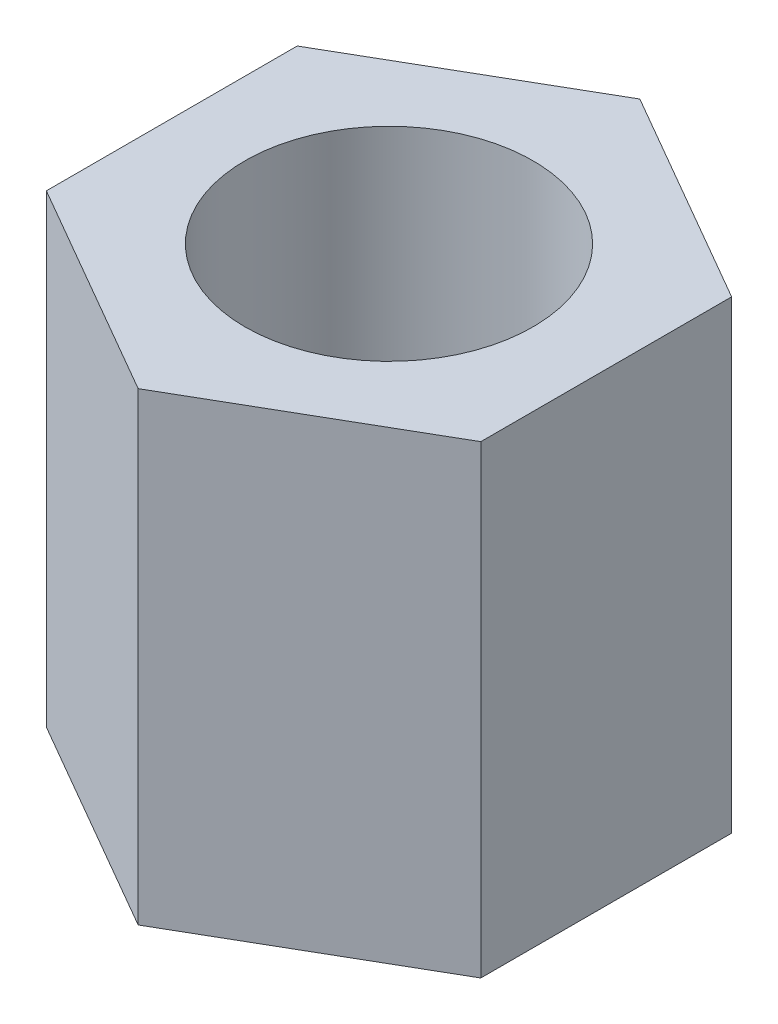
ISO-10303-21;
HEADER;
FILE_DESCRIPTION(('STEP AP214'),'2;1');
FILE_NAME('part.step','',(''),(''),'','','');
FILE_SCHEMA(('AUTOMOTIVE_DESIGN { 1 0 10303 214 1 1 1 1 }'));
ENDSEC;
DATA;
#1=APPLICATION_CONTEXT('core data for automotive mechanical design processes');
#2=APPLICATION_PROTOCOL_DEFINITION('international standard','automotive_design',2000,#1);
#3=PRODUCT_CONTEXT('',#1,'mechanical');
#4=PRODUCT('Part','Part','',(#3));
#5=PRODUCT_RELATED_PRODUCT_CATEGORY('part','',(#4));
#6=PRODUCT_DEFINITION_FORMATION('','',#4);
#7=PRODUCT_DEFINITION_CONTEXT('part definition',#1,'design');
#8=PRODUCT_DEFINITION('design','',#6,#7);
#9=PRODUCT_DEFINITION_SHAPE('','',#8);
#10=(LENGTH_UNIT() NAMED_UNIT(*) SI_UNIT(.MILLI.,.METRE.));
#11=(NAMED_UNIT(*) PLANE_ANGLE_UNIT() SI_UNIT($,.RADIAN.));
#12=(NAMED_UNIT(*) SI_UNIT($,.STERADIAN.) SOLID_ANGLE_UNIT());
#13=UNCERTAINTY_MEASURE_WITH_UNIT(LENGTH_MEASURE(1.E-05),#10,'distance_accuracy_value','');
#14=(GEOMETRIC_REPRESENTATION_CONTEXT(3) GLOBAL_UNCERTAINTY_ASSIGNED_CONTEXT((#13)) GLOBAL_UNIT_ASSIGNED_CONTEXT((#10,
#11,#12)) REPRESENTATION_CONTEXT('',''));
#15=CARTESIAN_POINT('',(0.,0.,0.));
#16=DIRECTION('',(0.,0.,1.));
#17=DIRECTION('',(1.,0.,0.));
#18=AXIS2_PLACEMENT_3D('',#15,#16,#17);
#19=CARTESIAN_POINT('',(0.,5.,0.));
#20=DIRECTION('',(0.,1.,0.));
#21=DIRECTION('',(0.,0.,1.));
#22=AXIS2_PLACEMENT_3D('',#19,#20,#21);
#23=PLANE('',#22);
#24=DIRECTION('',(-0.866025403784439,0.,-0.5));
#25=VECTOR('',#24,1.);
#26=CARTESIAN_POINT('',(2.33826859021798,5.,-1.35));
#27=LINE('',#26,#25);
#28=CARTESIAN_POINT('',(2.33826859021798,5.,-1.35));
#29=VERTEX_POINT('',#28);
#30=CARTESIAN_POINT('',(0.,5.,-2.7));
#31=VERTEX_POINT('',#30);
#32=EDGE_CURVE('E130',#29,#31,#27,.T.);
#33=ORIENTED_EDGE('',*,*,#32,.T.);
#34=DIRECTION('',(-0.866025403784439,0.,0.5));
#35=VECTOR('',#34,1.);
#36=CARTESIAN_POINT('',(0.,5.,-2.7));
#37=LINE('',#36,#35);
#38=CARTESIAN_POINT('',(-2.33826859021798,5.,-1.35));
#39=VERTEX_POINT('',#38);
#40=EDGE_CURVE('E88',#31,#39,#37,.T.);
#41=ORIENTED_EDGE('',*,*,#40,.T.);
#42=DIRECTION('',(0.,0.,1.));
#43=VECTOR('',#42,1.);
#44=CARTESIAN_POINT('',(-2.33826859021798,5.,-1.35));
#45=LINE('',#44,#43);
#46=CARTESIAN_POINT('',(-2.33826859021798,5.,1.35));
#47=VERTEX_POINT('',#46);
#48=EDGE_CURVE('E101',#39,#47,#45,.T.);
#49=ORIENTED_EDGE('',*,*,#48,.T.);
#50=DIRECTION('',(0.866025403784439,0.,0.5));
#51=VECTOR('',#50,1.);
#52=CARTESIAN_POINT('',(-2.33826859021798,5.,1.35));
#53=LINE('',#52,#51);
#54=CARTESIAN_POINT('',(0.,5.,2.7));
#55=VERTEX_POINT('',#54);
#56=EDGE_CURVE('E95',#47,#55,#53,.T.);
#57=ORIENTED_EDGE('',*,*,#56,.T.);
#58=DIRECTION('',(0.866025403784439,0.,-0.5));
#59=VECTOR('',#58,1.);
#60=CARTESIAN_POINT('',(0.,5.,2.7));
#61=LINE('',#60,#59);
#62=CARTESIAN_POINT('',(2.33826859021798,5.,1.35));
#63=VERTEX_POINT('',#62);
#64=EDGE_CURVE('E99',#55,#63,#61,.T.);
#65=ORIENTED_EDGE('',*,*,#64,.T.);
#66=DIRECTION('',(0.,0.,-1.));
#67=VECTOR('',#66,1.);
#68=CARTESIAN_POINT('',(2.33826859021798,5.,1.35));
#69=LINE('',#68,#67);
#70=EDGE_CURVE('E51',#63,#29,#69,.T.);
#71=ORIENTED_EDGE('',*,*,#70,.T.);
#72=EDGE_LOOP('',(#33,#41,#49,#57,#65,#71));
#73=FACE_BOUND('',#72,.T.);
#74=CARTESIAN_POINT('',(0.,5.,0.));
#75=DIRECTION('',(0.,1.,0.));
#76=DIRECTION('',(0.,0.,1.));
#77=AXIS2_PLACEMENT_3D('',#74,#75,#76);
#78=CIRCLE('',#77,1.55);
#79=CARTESIAN_POINT('',(0.,5.,1.55));
#80=VERTEX_POINT('',#79);
#81=EDGE_CURVE('E123',#80,#80,#78,.T.);
#82=ORIENTED_EDGE('',*,*,#81,.F.);
#83=EDGE_LOOP('',(#82));
#84=FACE_BOUND('',#83,.T.);
#85=ADVANCED_FACE('F34',(#73,#84),#23,.T.);
#86=CARTESIAN_POINT('',(0.,0.,0.));
#87=DIRECTION('',(0.,1.,0.));
#88=DIRECTION('',(0.,0.,1.));
#89=AXIS2_PLACEMENT_3D('',#86,#87,#88);
#90=PLANE('',#89);
#91=DIRECTION('',(-0.866025403784439,0.,-0.5));
#92=VECTOR('',#91,1.);
#93=CARTESIAN_POINT('',(2.33826859021798,0.,-1.35));
#94=LINE('',#93,#92);
#95=CARTESIAN_POINT('',(2.33826859021798,0.,-1.35));
#96=VERTEX_POINT('',#95);
#97=CARTESIAN_POINT('',(0.,0.,-2.7));
#98=VERTEX_POINT('',#97);
#99=EDGE_CURVE('E119',#96,#98,#94,.T.);
#100=ORIENTED_EDGE('',*,*,#99,.F.);
#101=DIRECTION('',(0.,0.,-1.));
#102=VECTOR('',#101,1.);
#103=CARTESIAN_POINT('',(2.33826859021798,0.,1.35));
#104=LINE('',#103,#102);
#105=CARTESIAN_POINT('',(2.33826859021798,0.,1.35));
#106=VERTEX_POINT('',#105);
#107=EDGE_CURVE('E80',#106,#96,#104,.T.);
#108=ORIENTED_EDGE('',*,*,#107,.F.);
#109=DIRECTION('',(0.866025403784439,0.,-0.5));
#110=VECTOR('',#109,1.);
#111=CARTESIAN_POINT('',(0.,0.,2.7));
#112=LINE('',#111,#110);
#113=CARTESIAN_POINT('',(0.,0.,2.7));
#114=VERTEX_POINT('',#113);
#115=EDGE_CURVE('E74',#114,#106,#112,.T.);
#116=ORIENTED_EDGE('',*,*,#115,.F.);
#117=DIRECTION('',(0.866025403784439,0.,0.5));
#118=VECTOR('',#117,1.);
#119=CARTESIAN_POINT('',(-2.33826859021798,0.,1.35));
#120=LINE('',#119,#118);
#121=CARTESIAN_POINT('',(-2.33826859021798,0.,1.35));
#122=VERTEX_POINT('',#121);
#123=EDGE_CURVE('E109',#122,#114,#120,.T.);
#124=ORIENTED_EDGE('',*,*,#123,.F.);
#125=DIRECTION('',(0.,0.,1.));
#126=VECTOR('',#125,1.);
#127=CARTESIAN_POINT('',(-2.33826859021798,0.,-1.35));
#128=LINE('',#127,#126);
#129=CARTESIAN_POINT('',(-2.33826859021798,0.,-1.35));
#130=VERTEX_POINT('',#129);
#131=EDGE_CURVE('E125',#130,#122,#128,.T.);
#132=ORIENTED_EDGE('',*,*,#131,.F.);
#133=DIRECTION('',(-0.866025403784439,0.,0.5));
#134=VECTOR('',#133,1.);
#135=CARTESIAN_POINT('',(0.,0.,-2.7));
#136=LINE('',#135,#134);
#137=EDGE_CURVE('E122',#98,#130,#136,.T.);
#138=ORIENTED_EDGE('',*,*,#137,.F.);
#139=EDGE_LOOP('',(#100,#108,#116,#124,#132,#138));
#140=FACE_BOUND('',#139,.T.);
#141=CARTESIAN_POINT('',(0.,0.,0.));
#142=DIRECTION('',(0.,1.,0.));
#143=DIRECTION('',(0.,0.,1.));
#144=AXIS2_PLACEMENT_3D('',#141,#142,#143);
#145=CIRCLE('',#144,1.55);
#146=CARTESIAN_POINT('',(0.,0.,1.55));
#147=VERTEX_POINT('',#146);
#148=EDGE_CURVE('E223',#147,#147,#145,.T.);
#149=ORIENTED_EDGE('',*,*,#148,.T.);
#150=EDGE_LOOP('',(#149));
#151=FACE_BOUND('',#150,.T.);
#152=ADVANCED_FACE('F139',(#140,#151),#90,.F.);
#153=CARTESIAN_POINT('',(2.33826859021798,5.,-1.35));
#154=DIRECTION('',(-0.5,0.,0.866025403784439));
#155=DIRECTION('',(0.866025403784439,0.,0.5));
#156=AXIS2_PLACEMENT_3D('',#153,#154,#155);
#157=PLANE('',#156);
#158=ORIENTED_EDGE('',*,*,#99,.T.);
#159=DIRECTION('',(0.,-1.,0.));
#160=VECTOR('',#159,1.);
#161=CARTESIAN_POINT('',(0.,5.,-2.7));
#162=LINE('',#161,#160);
#163=EDGE_CURVE('E11',#31,#98,#162,.T.);
#164=ORIENTED_EDGE('',*,*,#163,.F.);
#165=ORIENTED_EDGE('',*,*,#32,.F.);
#166=DIRECTION('',(0.,-1.,0.));
#167=VECTOR('',#166,1.);
#168=CARTESIAN_POINT('',(2.33826859021798,5.,-1.35));
#169=LINE('',#168,#167);
#170=EDGE_CURVE('E115',#29,#96,#169,.T.);
#171=ORIENTED_EDGE('',*,*,#170,.T.);
#172=EDGE_LOOP('',(#158,#164,#165,#171));
#173=FACE_BOUND('',#172,.T.);
#174=ADVANCED_FACE('F36',(#173),#157,.F.);
#175=CARTESIAN_POINT('',(0.,5.,-2.7));
#176=DIRECTION('',(0.5,0.,0.866025403784438));
#177=DIRECTION('',(0.866025403784439,0.,-0.5));
#178=AXIS2_PLACEMENT_3D('',#175,#176,#177);
#179=PLANE('',#178);
#180=ORIENTED_EDGE('',*,*,#137,.T.);
#181=DIRECTION('',(0.,-1.,0.));
#182=VECTOR('',#181,1.);
#183=CARTESIAN_POINT('',(-2.33826859021798,5.,-1.35));
#184=LINE('',#183,#182);
#185=EDGE_CURVE('E43',#39,#130,#184,.T.);
#186=ORIENTED_EDGE('',*,*,#185,.F.);
#187=ORIENTED_EDGE('',*,*,#40,.F.);
#188=ORIENTED_EDGE('',*,*,#163,.T.);
#189=EDGE_LOOP('',(#180,#186,#187,#188));
#190=FACE_BOUND('',#189,.T.);
#191=ADVANCED_FACE('F164',(#190),#179,.F.);
#192=CARTESIAN_POINT('',(-2.33826859021798,5.,-1.35));
#193=DIRECTION('',(1.,0.,0.));
#194=DIRECTION('',(0.,0.,-1.));
#195=AXIS2_PLACEMENT_3D('',#192,#193,#194);
#196=PLANE('',#195);
#197=ORIENTED_EDGE('',*,*,#131,.T.);
#198=DIRECTION('',(0.,-1.,0.));
#199=VECTOR('',#198,1.);
#200=CARTESIAN_POINT('',(-2.33826859021798,5.,1.35));
#201=LINE('',#200,#199);
#202=EDGE_CURVE('E110',#47,#122,#201,.T.);
#203=ORIENTED_EDGE('',*,*,#202,.F.);
#204=ORIENTED_EDGE('',*,*,#48,.F.);
#205=ORIENTED_EDGE('',*,*,#185,.T.);
#206=EDGE_LOOP('',(#197,#203,#204,#205));
#207=FACE_BOUND('',#206,.T.);
#208=ADVANCED_FACE('F136',(#207),#196,.F.);
#209=CARTESIAN_POINT('',(-2.33826859021798,5.,1.35));
#210=DIRECTION('',(0.5,0.,-0.866025403784439));
#211=DIRECTION('',(-0.866025403784439,0.,-0.5));
#212=AXIS2_PLACEMENT_3D('',#209,#210,#211);
#213=PLANE('',#212);
#214=ORIENTED_EDGE('',*,*,#123,.T.);
#215=DIRECTION('',(0.,-1.,0.));
#216=VECTOR('',#215,1.);
#217=CARTESIAN_POINT('',(0.,5.,2.7));
#218=LINE('',#217,#216);
#219=EDGE_CURVE('E106',#55,#114,#218,.T.);
#220=ORIENTED_EDGE('',*,*,#219,.F.);
#221=ORIENTED_EDGE('',*,*,#56,.F.);
#222=ORIENTED_EDGE('',*,*,#202,.T.);
#223=EDGE_LOOP('',(#214,#220,#221,#222));
#224=FACE_BOUND('',#223,.T.);
#225=ADVANCED_FACE('F107',(#224),#213,.F.);
#226=CARTESIAN_POINT('',(0.,5.,2.7));
#227=DIRECTION('',(-0.5,0.,-0.866025403784439));
#228=DIRECTION('',(-0.866025403784439,0.,0.5));
#229=AXIS2_PLACEMENT_3D('',#226,#227,#228);
#230=PLANE('',#229);
#231=ORIENTED_EDGE('',*,*,#115,.T.);
#232=DIRECTION('',(0.,-1.,0.));
#233=VECTOR('',#232,1.);
#234=CARTESIAN_POINT('',(2.33826859021798,5.,1.35));
#235=LINE('',#234,#233);
#236=EDGE_CURVE('E111',#63,#106,#235,.T.);
#237=ORIENTED_EDGE('',*,*,#236,.F.);
#238=ORIENTED_EDGE('',*,*,#64,.F.);
#239=ORIENTED_EDGE('',*,*,#219,.T.);
#240=EDGE_LOOP('',(#231,#237,#238,#239));
#241=FACE_BOUND('',#240,.T.);
#242=ADVANCED_FACE('F113',(#241),#230,.F.);
#243=CARTESIAN_POINT('',(2.33826859021798,5.,1.35));
#244=DIRECTION('',(-1.,0.,0.));
#245=DIRECTION('',(0.,0.,1.));
#246=AXIS2_PLACEMENT_3D('',#243,#244,#245);
#247=PLANE('',#246);
#248=ORIENTED_EDGE('',*,*,#107,.T.);
#249=ORIENTED_EDGE('',*,*,#170,.F.);
#250=ORIENTED_EDGE('',*,*,#70,.F.);
#251=ORIENTED_EDGE('',*,*,#236,.T.);
#252=EDGE_LOOP('',(#248,#249,#250,#251));
#253=FACE_BOUND('',#252,.T.);
#254=ADVANCED_FACE('F144',(#253),#247,.F.);
#255=CARTESIAN_POINT('',(0.,5.,0.));
#256=DIRECTION('',(0.,-1.,0.));
#257=DIRECTION('',(0.,0.,-1.));
#258=AXIS2_PLACEMENT_3D('',#255,#256,#257);
#259=CYLINDRICAL_SURFACE('',#258,1.55);
#260=ORIENTED_EDGE('',*,*,#81,.T.);
#261=EDGE_LOOP('',(#260));
#262=FACE_BOUND('',#261,.T.);
#263=ORIENTED_EDGE('',*,*,#148,.F.);
#264=EDGE_LOOP('',(#263));
#265=FACE_BOUND('',#264,.T.);
#266=ADVANCED_FACE('F146',(#262,#265),#259,.F.);
#267=CLOSED_SHELL('',(#85,#152,#174,#191,#208,#225,#242,#254,#266));
#268=MANIFOLD_SOLID_BREP('B2',#267);
#269=ADVANCED_BREP_SHAPE_REPRESENTATION('',(#18,#268),#14);
#270=SHAPE_DEFINITION_REPRESENTATION(#9,#269);
ENDSEC;
END-ISO-10303-21;
